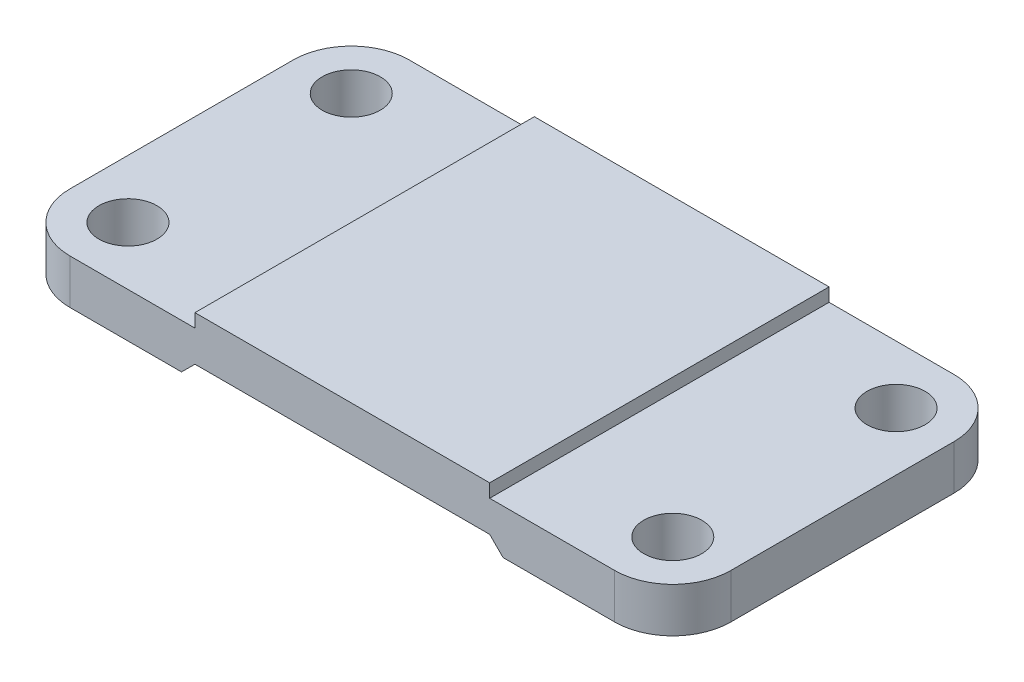
ISO-10303-21;
HEADER;
FILE_DESCRIPTION(('STEP AP214'),'2;1');
FILE_NAME('part.step','',(''),(''),'','','');
FILE_SCHEMA(('AUTOMOTIVE_DESIGN { 1 0 10303 214 1 1 1 1 }'));
ENDSEC;
DATA;
#1=APPLICATION_CONTEXT('core data for automotive mechanical design processes');
#2=APPLICATION_PROTOCOL_DEFINITION('international standard','automotive_design',2000,#1);
#3=PRODUCT_CONTEXT('',#1,'mechanical');
#4=PRODUCT('Part','Part','',(#3));
#5=PRODUCT_RELATED_PRODUCT_CATEGORY('part','',(#4));
#6=PRODUCT_DEFINITION_FORMATION('','',#4);
#7=PRODUCT_DEFINITION_CONTEXT('part definition',#1,'design');
#8=PRODUCT_DEFINITION('design','',#6,#7);
#9=PRODUCT_DEFINITION_SHAPE('','',#8);
#10=(LENGTH_UNIT() NAMED_UNIT(*) SI_UNIT(.MILLI.,.METRE.));
#11=(NAMED_UNIT(*) PLANE_ANGLE_UNIT() SI_UNIT($,.RADIAN.));
#12=(NAMED_UNIT(*) SI_UNIT($,.STERADIAN.) SOLID_ANGLE_UNIT());
#13=UNCERTAINTY_MEASURE_WITH_UNIT(LENGTH_MEASURE(1.E-05),#10,'distance_accuracy_value','');
#14=(GEOMETRIC_REPRESENTATION_CONTEXT(3) GLOBAL_UNCERTAINTY_ASSIGNED_CONTEXT((#13)) GLOBAL_UNIT_ASSIGNED_CONTEXT((#10,
#11,#12)) REPRESENTATION_CONTEXT('',''));
#15=CARTESIAN_POINT('',(0.,0.,0.));
#16=DIRECTION('',(0.,0.,1.));
#17=DIRECTION('',(1.,0.,0.));
#18=AXIS2_PLACEMENT_3D('',#15,#16,#17);
#19=CARTESIAN_POINT('',(-61.,0.,25.));
#20=DIRECTION('',(0.,1.,0.));
#21=DIRECTION('',(0.,0.,1.));
#22=AXIS2_PLACEMENT_3D('',#19,#20,#21);
#23=PLANE('',#22);
#24=CARTESIAN_POINT('',(61.,0.,-25.));
#25=DIRECTION('',(0.,1.,0.));
#26=DIRECTION('',(0.,0.,-1.));
#27=AXIS2_PLACEMENT_3D('',#24,#25,#26);
#28=CIRCLE('',#27,6.5);
#29=CARTESIAN_POINT('',(61.,0.,-31.5));
#30=VERTEX_POINT('',#29);
#31=EDGE_CURVE('E262',#30,#30,#28,.T.);
#32=ORIENTED_EDGE('',*,*,#31,.F.);
#33=EDGE_LOOP('',(#32));
#34=FACE_BOUND('',#33,.T.);
#35=CARTESIAN_POINT('',(61.,0.,25.));
#36=DIRECTION('',(0.,1.,0.));
#37=DIRECTION('',(0.,0.,1.));
#38=AXIS2_PLACEMENT_3D('',#35,#36,#37);
#39=CIRCLE('',#38,6.5);
#40=CARTESIAN_POINT('',(61.,0.,31.5));
#41=VERTEX_POINT('',#40);
#42=EDGE_CURVE('E268',#41,#41,#39,.T.);
#43=ORIENTED_EDGE('',*,*,#42,.F.);
#44=EDGE_LOOP('',(#43));
#45=FACE_BOUND('',#44,.T.);
#46=DIRECTION('',(-1.,0.,0.));
#47=VECTOR('',#46,1.);
#48=CARTESIAN_POINT('',(-60.9999999999999,0.,-38.));
#49=LINE('',#48,#47);
#50=CARTESIAN_POINT('',(60.9999999999999,0.,-38.));
#51=VERTEX_POINT('',#50);
#52=CARTESIAN_POINT('',(33.,0.,-38.));
#53=VERTEX_POINT('',#52);
#54=EDGE_CURVE('E165',#51,#53,#49,.T.);
#55=ORIENTED_EDGE('',*,*,#54,.T.);
#56=DIRECTION('',(0.,0.,1.));
#57=VECTOR('',#56,1.);
#58=CARTESIAN_POINT('',(33.,0.,-38.));
#59=LINE('',#58,#57);
#60=CARTESIAN_POINT('',(33.,0.,38.));
#61=VERTEX_POINT('',#60);
#62=EDGE_CURVE('E150',#53,#61,#59,.T.);
#63=ORIENTED_EDGE('',*,*,#62,.T.);
#64=DIRECTION('',(1.,0.,0.));
#65=VECTOR('',#64,1.);
#66=CARTESIAN_POINT('',(-60.9999999999999,0.,38.));
#67=LINE('',#66,#65);
#68=CARTESIAN_POINT('',(60.9999999999999,0.,38.));
#69=VERTEX_POINT('',#68);
#70=EDGE_CURVE('E219',#61,#69,#67,.T.);
#71=ORIENTED_EDGE('',*,*,#70,.T.);
#72=CARTESIAN_POINT('',(61.,0.,25.));
#73=DIRECTION('',(0.,1.,0.));
#74=DIRECTION('',(0.,0.,1.));
#75=AXIS2_PLACEMENT_3D('',#72,#73,#74);
#76=CIRCLE('',#75,13.);
#77=CARTESIAN_POINT('',(74.,0.,24.9999999999999));
#78=VERTEX_POINT('',#77);
#79=EDGE_CURVE('E224',#69,#78,#76,.T.);
#80=ORIENTED_EDGE('',*,*,#79,.T.);
#81=DIRECTION('',(0.,0.,-1.));
#82=VECTOR('',#81,1.);
#83=CARTESIAN_POINT('',(74.,0.,-24.9999999999999));
#84=LINE('',#83,#82);
#85=CARTESIAN_POINT('',(74.,0.,-24.9999999999999));
#86=VERTEX_POINT('',#85);
#87=EDGE_CURVE('E226',#78,#86,#84,.T.);
#88=ORIENTED_EDGE('',*,*,#87,.T.);
#89=CARTESIAN_POINT('',(61.,0.,-25.));
#90=DIRECTION('',(0.,1.,0.));
#91=DIRECTION('',(0.,0.,-1.));
#92=AXIS2_PLACEMENT_3D('',#89,#90,#91);
#93=CIRCLE('',#92,13.);
#94=EDGE_CURVE('E174',#86,#51,#93,.T.);
#95=ORIENTED_EDGE('',*,*,#94,.T.);
#96=EDGE_LOOP('',(#55,#63,#71,#80,#88,#95));
#97=FACE_BOUND('',#96,.T.);
#98=ADVANCED_FACE('F38',(#34,#45,#97),#23,.T.);
#99=CARTESIAN_POINT('',(-61.,-10.,25.));
#100=DIRECTION('',(0.,1.,0.));
#101=DIRECTION('',(0.,0.,1.));
#102=AXIS2_PLACEMENT_3D('',#99,#100,#101);
#103=PLANE('',#102);
#104=CARTESIAN_POINT('',(-61.,-10.,-25.));
#105=DIRECTION('',(0.,1.,0.));
#106=DIRECTION('',(0.,0.,1.));
#107=AXIS2_PLACEMENT_3D('',#104,#105,#106);
#108=CIRCLE('',#107,6.5);
#109=CARTESIAN_POINT('',(-61.,-10.,-18.5));
#110=VERTEX_POINT('',#109);
#111=EDGE_CURVE('E220',#110,#110,#108,.T.);
#112=ORIENTED_EDGE('',*,*,#111,.T.);
#113=EDGE_LOOP('',(#112));
#114=FACE_BOUND('',#113,.T.);
#115=CARTESIAN_POINT('',(-61.,-10.,25.));
#116=DIRECTION('',(0.,1.,0.));
#117=DIRECTION('',(0.,0.,-1.));
#118=AXIS2_PLACEMENT_3D('',#115,#116,#117);
#119=CIRCLE('',#118,6.5);
#120=CARTESIAN_POINT('',(-61.,-10.,18.5));
#121=VERTEX_POINT('',#120);
#122=EDGE_CURVE('E271',#121,#121,#119,.T.);
#123=ORIENTED_EDGE('',*,*,#122,.T.);
#124=EDGE_LOOP('',(#123));
#125=FACE_BOUND('',#124,.T.);
#126=DIRECTION('',(-1.,0.,0.));
#127=VECTOR('',#126,1.);
#128=CARTESIAN_POINT('',(-60.9999999999999,-10.,-38.));
#129=LINE('',#128,#127);
#130=CARTESIAN_POINT('',(-36.,-10.,-38.));
#131=VERTEX_POINT('',#130);
#132=CARTESIAN_POINT('',(-60.9999999999999,-10.,-38.));
#133=VERTEX_POINT('',#132);
#134=EDGE_CURVE('E244',#131,#133,#129,.T.);
#135=ORIENTED_EDGE('',*,*,#134,.F.);
#136=DIRECTION('',(0.,0.,1.));
#137=VECTOR('',#136,1.);
#138=CARTESIAN_POINT('',(-36.,-10.,-38.));
#139=LINE('',#138,#137);
#140=CARTESIAN_POINT('',(-36.,-10.,38.));
#141=VERTEX_POINT('',#140);
#142=EDGE_CURVE('E280',#131,#141,#139,.T.);
#143=ORIENTED_EDGE('',*,*,#142,.T.);
#144=DIRECTION('',(1.,0.,0.));
#145=VECTOR('',#144,1.);
#146=CARTESIAN_POINT('',(-60.9999999999999,-10.,38.));
#147=LINE('',#146,#145);
#148=CARTESIAN_POINT('',(-60.9999999999999,-10.,38.));
#149=VERTEX_POINT('',#148);
#150=EDGE_CURVE('E251',#149,#141,#147,.T.);
#151=ORIENTED_EDGE('',*,*,#150,.F.);
#152=CARTESIAN_POINT('',(-61.,-10.,25.));
#153=DIRECTION('',(0.,1.,0.));
#154=DIRECTION('',(0.,0.,1.));
#155=AXIS2_PLACEMENT_3D('',#152,#153,#154);
#156=CIRCLE('',#155,13.);
#157=CARTESIAN_POINT('',(-74.,-10.,24.9999999999999));
#158=VERTEX_POINT('',#157);
#159=EDGE_CURVE('E185',#158,#149,#156,.T.);
#160=ORIENTED_EDGE('',*,*,#159,.F.);
#161=DIRECTION('',(0.,0.,1.));
#162=VECTOR('',#161,1.);
#163=CARTESIAN_POINT('',(-74.,-10.,-24.9999999999999));
#164=LINE('',#163,#162);
#165=CARTESIAN_POINT('',(-74.,-10.,-24.9999999999999));
#166=VERTEX_POINT('',#165);
#167=EDGE_CURVE('E201',#166,#158,#164,.T.);
#168=ORIENTED_EDGE('',*,*,#167,.F.);
#169=CARTESIAN_POINT('',(-61.,-10.,-25.));
#170=DIRECTION('',(0.,1.,0.));
#171=DIRECTION('',(0.,0.,1.));
#172=AXIS2_PLACEMENT_3D('',#169,#170,#171);
#173=CIRCLE('',#172,13.);
#174=EDGE_CURVE('E207',#133,#166,#173,.T.);
#175=ORIENTED_EDGE('',*,*,#174,.F.);
#176=EDGE_LOOP('',(#135,#143,#151,#160,#168,#175));
#177=FACE_BOUND('',#176,.T.);
#178=ADVANCED_FACE('F330',(#114,#125,#177),#103,.F.);
#179=CARTESIAN_POINT('',(-61.,-10.,25.));
#180=DIRECTION('',(0.,1.,0.));
#181=DIRECTION('',(0.,0.,1.));
#182=AXIS2_PLACEMENT_3D('',#179,#180,#181);
#183=CYLINDRICAL_SURFACE('',#182,13.);
#184=CARTESIAN_POINT('',(-61.,0.,25.));
#185=DIRECTION('',(0.,1.,0.));
#186=DIRECTION('',(0.,0.,1.));
#187=AXIS2_PLACEMENT_3D('',#184,#185,#186);
#188=CIRCLE('',#187,13.);
#189=CARTESIAN_POINT('',(-74.,0.,24.9999999999999));
#190=VERTEX_POINT('',#189);
#191=CARTESIAN_POINT('',(-60.9999999999999,0.,38.));
#192=VERTEX_POINT('',#191);
#193=EDGE_CURVE('E216',#190,#192,#188,.T.);
#194=ORIENTED_EDGE('',*,*,#193,.F.);
#195=DIRECTION('',(0.,1.,0.));
#196=VECTOR('',#195,1.);
#197=CARTESIAN_POINT('',(-74.,-10.,24.9999999999999));
#198=LINE('',#197,#196);
#199=EDGE_CURVE('E11',#158,#190,#198,.T.);
#200=ORIENTED_EDGE('',*,*,#199,.F.);
#201=ORIENTED_EDGE('',*,*,#159,.T.);
#202=DIRECTION('',(0.,1.,0.));
#203=VECTOR('',#202,1.);
#204=CARTESIAN_POINT('',(-60.9999999999999,-10.,38.));
#205=LINE('',#204,#203);
#206=EDGE_CURVE('E42',#149,#192,#205,.T.);
#207=ORIENTED_EDGE('',*,*,#206,.T.);
#208=EDGE_LOOP('',(#194,#200,#201,#207));
#209=FACE_BOUND('',#208,.T.);
#210=ADVANCED_FACE('F40',(#209),#183,.T.);
#211=CARTESIAN_POINT('',(-74.,-10.,-24.9999999999999));
#212=DIRECTION('',(-1.,0.,0.));
#213=DIRECTION('',(0.,0.,1.));
#214=AXIS2_PLACEMENT_3D('',#211,#212,#213);
#215=PLANE('',#214);
#216=DIRECTION('',(0.,0.,1.));
#217=VECTOR('',#216,1.);
#218=CARTESIAN_POINT('',(-74.,0.,-24.9999999999999));
#219=LINE('',#218,#217);
#220=CARTESIAN_POINT('',(-74.,0.,-24.9999999999999));
#221=VERTEX_POINT('',#220);
#222=EDGE_CURVE('E179',#221,#190,#219,.T.);
#223=ORIENTED_EDGE('',*,*,#222,.F.);
#224=DIRECTION('',(0.,1.,0.));
#225=VECTOR('',#224,1.);
#226=CARTESIAN_POINT('',(-74.,-10.,-24.9999999999999));
#227=LINE('',#226,#225);
#228=EDGE_CURVE('E47',#166,#221,#227,.T.);
#229=ORIENTED_EDGE('',*,*,#228,.F.);
#230=ORIENTED_EDGE('',*,*,#167,.T.);
#231=ORIENTED_EDGE('',*,*,#199,.T.);
#232=EDGE_LOOP('',(#223,#229,#230,#231));
#233=FACE_BOUND('',#232,.T.);
#234=ADVANCED_FACE('F332',(#233),#215,.T.);
#235=CARTESIAN_POINT('',(-61.,-10.,-25.));
#236=DIRECTION('',(0.,1.,0.));
#237=DIRECTION('',(0.,0.,1.));
#238=AXIS2_PLACEMENT_3D('',#235,#236,#237);
#239=CYLINDRICAL_SURFACE('',#238,13.);
#240=CARTESIAN_POINT('',(-61.,0.,-25.));
#241=DIRECTION('',(0.,1.,0.));
#242=DIRECTION('',(0.,0.,1.));
#243=AXIS2_PLACEMENT_3D('',#240,#241,#242);
#244=CIRCLE('',#243,13.);
#245=CARTESIAN_POINT('',(-60.9999999999999,0.,-38.));
#246=VERTEX_POINT('',#245);
#247=EDGE_CURVE('E175',#246,#221,#244,.T.);
#248=ORIENTED_EDGE('',*,*,#247,.F.);
#249=DIRECTION('',(0.,1.,0.));
#250=VECTOR('',#249,1.);
#251=CARTESIAN_POINT('',(-60.9999999999999,-10.,-38.));
#252=LINE('',#251,#250);
#253=EDGE_CURVE('E188',#133,#246,#252,.T.);
#254=ORIENTED_EDGE('',*,*,#253,.F.);
#255=ORIENTED_EDGE('',*,*,#174,.T.);
#256=ORIENTED_EDGE('',*,*,#228,.T.);
#257=EDGE_LOOP('',(#248,#254,#255,#256));
#258=FACE_BOUND('',#257,.T.);
#259=ADVANCED_FACE('F336',(#258),#239,.T.);
#260=CARTESIAN_POINT('',(-60.9999999999999,-10.,-38.));
#261=DIRECTION('',(0.,0.,-1.));
#262=DIRECTION('',(-1.,0.,0.));
#263=AXIS2_PLACEMENT_3D('',#260,#261,#262);
#264=PLANE('',#263);
#265=DIRECTION('',(-0.707106781186551,-0.707106781186544,0.));
#266=VECTOR('',#265,1.);
#267=CARTESIAN_POINT('',(-33.,-7.00000000000001,-38.));
#268=LINE('',#267,#266);
#269=CARTESIAN_POINT('',(-33.,-7.00000000000001,-38.));
#270=VERTEX_POINT('',#269);
#271=EDGE_CURVE('E291',#270,#131,#268,.T.);
#272=ORIENTED_EDGE('',*,*,#271,.T.);
#273=ORIENTED_EDGE('',*,*,#134,.T.);
#274=ORIENTED_EDGE('',*,*,#253,.T.);
#275=CARTESIAN_POINT('',(-33.,0.,-38.));
#276=VERTEX_POINT('',#275);
#277=EDGE_CURVE('E176',#276,#246,#49,.T.);
#278=ORIENTED_EDGE('',*,*,#277,.F.);
#279=DIRECTION('',(0.,-1.,0.));
#280=VECTOR('',#279,1.);
#281=CARTESIAN_POINT('',(-33.,0.,-38.));
#282=LINE('',#281,#280);
#283=CARTESIAN_POINT('',(-33.,3.,-38.));
#284=VERTEX_POINT('',#283);
#285=EDGE_CURVE('E158',#284,#276,#282,.T.);
#286=ORIENTED_EDGE('',*,*,#285,.F.);
#287=DIRECTION('',(-1.,0.,0.));
#288=VECTOR('',#287,1.);
#289=CARTESIAN_POINT('',(-33.,3.,-38.));
#290=LINE('',#289,#288);
#291=CARTESIAN_POINT('',(33.,3.,-38.));
#292=VERTEX_POINT('',#291);
#293=EDGE_CURVE('E169',#292,#284,#290,.T.);
#294=ORIENTED_EDGE('',*,*,#293,.F.);
#295=DIRECTION('',(0.,1.,0.));
#296=VECTOR('',#295,1.);
#297=CARTESIAN_POINT('',(33.,3.,-38.));
#298=LINE('',#297,#296);
#299=EDGE_CURVE('E153',#53,#292,#298,.T.);
#300=ORIENTED_EDGE('',*,*,#299,.F.);
#301=ORIENTED_EDGE('',*,*,#54,.F.);
#302=DIRECTION('',(0.,1.,0.));
#303=VECTOR('',#302,1.);
#304=CARTESIAN_POINT('',(60.9999999999999,-10.,-38.));
#305=LINE('',#304,#303);
#306=CARTESIAN_POINT('',(60.9999999999999,-10.,-38.));
#307=VERTEX_POINT('',#306);
#308=EDGE_CURVE('E191',#307,#51,#305,.T.);
#309=ORIENTED_EDGE('',*,*,#308,.F.);
#310=CARTESIAN_POINT('',(36.,-10.,-38.));
#311=VERTEX_POINT('',#310);
#312=EDGE_CURVE('E212',#307,#311,#129,.T.);
#313=ORIENTED_EDGE('',*,*,#312,.T.);
#314=DIRECTION('',(-0.707106781186552,0.707106781186543,0.));
#315=VECTOR('',#314,1.);
#316=CARTESIAN_POINT('',(36.,-10.,-38.));
#317=LINE('',#316,#315);
#318=CARTESIAN_POINT('',(33.,-7.00000000000001,-38.));
#319=VERTEX_POINT('',#318);
#320=EDGE_CURVE('E63',#311,#319,#317,.T.);
#321=ORIENTED_EDGE('',*,*,#320,.T.);
#322=DIRECTION('',(-1.,0.,0.));
#323=VECTOR('',#322,1.);
#324=CARTESIAN_POINT('',(33.,-7.00000000000001,-38.));
#325=LINE('',#324,#323);
#326=EDGE_CURVE('E283',#319,#270,#325,.T.);
#327=ORIENTED_EDGE('',*,*,#326,.T.);
#328=EDGE_LOOP('',(#272,#273,#274,#278,#286,#294,#300,#301,#309,#313,#321,#327));
#329=FACE_BOUND('',#328,.T.);
#330=ADVANCED_FACE('F164',(#329),#264,.T.);
#331=CARTESIAN_POINT('',(61.,-10.,-25.));
#332=DIRECTION('',(0.,1.,0.));
#333=DIRECTION('',(0.,0.,1.));
#334=AXIS2_PLACEMENT_3D('',#331,#332,#333);
#335=CYLINDRICAL_SURFACE('',#334,13.);
#336=ORIENTED_EDGE('',*,*,#94,.F.);
#337=DIRECTION('',(0.,1.,0.));
#338=VECTOR('',#337,1.);
#339=CARTESIAN_POINT('',(74.,-10.,-24.9999999999999));
#340=LINE('',#339,#338);
#341=CARTESIAN_POINT('',(74.,-10.,-24.9999999999999));
#342=VERTEX_POINT('',#341);
#343=EDGE_CURVE('E193',#342,#86,#340,.T.);
#344=ORIENTED_EDGE('',*,*,#343,.F.);
#345=CARTESIAN_POINT('',(61.,-10.,-25.));
#346=DIRECTION('',(0.,1.,0.));
#347=DIRECTION('',(0.,0.,-1.));
#348=AXIS2_PLACEMENT_3D('',#345,#346,#347);
#349=CIRCLE('',#348,13.);
#350=EDGE_CURVE('E237',#342,#307,#349,.T.);
#351=ORIENTED_EDGE('',*,*,#350,.T.);
#352=ORIENTED_EDGE('',*,*,#308,.T.);
#353=EDGE_LOOP('',(#336,#344,#351,#352));
#354=FACE_BOUND('',#353,.T.);
#355=ADVANCED_FACE('F236',(#354),#335,.T.);
#356=CARTESIAN_POINT('',(74.,-10.,-24.9999999999999));
#357=DIRECTION('',(1.,0.,0.));
#358=DIRECTION('',(0.,0.,-1.));
#359=AXIS2_PLACEMENT_3D('',#356,#357,#358);
#360=PLANE('',#359);
#361=ORIENTED_EDGE('',*,*,#87,.F.);
#362=DIRECTION('',(0.,1.,0.));
#363=VECTOR('',#362,1.);
#364=CARTESIAN_POINT('',(74.,-10.,24.9999999999999));
#365=LINE('',#364,#363);
#366=CARTESIAN_POINT('',(74.,-10.,24.9999999999999));
#367=VERTEX_POINT('',#366);
#368=EDGE_CURVE('E195',#367,#78,#365,.T.);
#369=ORIENTED_EDGE('',*,*,#368,.F.);
#370=DIRECTION('',(0.,0.,-1.));
#371=VECTOR('',#370,1.);
#372=CARTESIAN_POINT('',(74.,-10.,-24.9999999999999));
#373=LINE('',#372,#371);
#374=EDGE_CURVE('E232',#367,#342,#373,.T.);
#375=ORIENTED_EDGE('',*,*,#374,.T.);
#376=ORIENTED_EDGE('',*,*,#343,.T.);
#377=EDGE_LOOP('',(#361,#369,#375,#376));
#378=FACE_BOUND('',#377,.T.);
#379=ADVANCED_FACE('F229',(#378),#360,.T.);
#380=CARTESIAN_POINT('',(61.,-10.,25.));
#381=DIRECTION('',(0.,1.,0.));
#382=DIRECTION('',(0.,0.,1.));
#383=AXIS2_PLACEMENT_3D('',#380,#381,#382);
#384=CYLINDRICAL_SURFACE('',#383,13.);
#385=ORIENTED_EDGE('',*,*,#79,.F.);
#386=DIRECTION('',(0.,1.,0.));
#387=VECTOR('',#386,1.);
#388=CARTESIAN_POINT('',(60.9999999999999,-10.,38.));
#389=LINE('',#388,#387);
#390=CARTESIAN_POINT('',(60.9999999999999,-10.,38.));
#391=VERTEX_POINT('',#390);
#392=EDGE_CURVE('E196',#391,#69,#389,.T.);
#393=ORIENTED_EDGE('',*,*,#392,.F.);
#394=CARTESIAN_POINT('',(61.,-10.,25.));
#395=DIRECTION('',(0.,1.,0.));
#396=DIRECTION('',(0.,0.,1.));
#397=AXIS2_PLACEMENT_3D('',#394,#395,#396);
#398=CIRCLE('',#397,13.);
#399=EDGE_CURVE('E248',#391,#367,#398,.T.);
#400=ORIENTED_EDGE('',*,*,#399,.T.);
#401=ORIENTED_EDGE('',*,*,#368,.T.);
#402=EDGE_LOOP('',(#385,#393,#400,#401));
#403=FACE_BOUND('',#402,.T.);
#404=ADVANCED_FACE('F382',(#403),#384,.T.);
#405=CARTESIAN_POINT('',(-60.9999999999999,-10.,38.));
#406=DIRECTION('',(0.,0.,1.));
#407=DIRECTION('',(1.,0.,0.));
#408=AXIS2_PLACEMENT_3D('',#405,#406,#407);
#409=PLANE('',#408);
#410=DIRECTION('',(-0.707106781186551,-0.707106781186544,0.));
#411=VECTOR('',#410,1.);
#412=CARTESIAN_POINT('',(-33.,-7.00000000000001,38.));
#413=LINE('',#412,#411);
#414=CARTESIAN_POINT('',(-33.,-7.00000000000001,38.));
#415=VERTEX_POINT('',#414);
#416=EDGE_CURVE('E295',#415,#141,#413,.T.);
#417=ORIENTED_EDGE('',*,*,#416,.F.);
#418=DIRECTION('',(-1.,0.,0.));
#419=VECTOR('',#418,1.);
#420=CARTESIAN_POINT('',(33.,-7.00000000000001,38.));
#421=LINE('',#420,#419);
#422=CARTESIAN_POINT('',(33.,-7.00000000000001,38.));
#423=VERTEX_POINT('',#422);
#424=EDGE_CURVE('E288',#423,#415,#421,.T.);
#425=ORIENTED_EDGE('',*,*,#424,.F.);
#426=DIRECTION('',(-0.707106781186552,0.707106781186543,0.));
#427=VECTOR('',#426,1.);
#428=CARTESIAN_POINT('',(36.,-10.,38.));
#429=LINE('',#428,#427);
#430=CARTESIAN_POINT('',(36.,-10.,38.));
#431=VERTEX_POINT('',#430);
#432=EDGE_CURVE('E292',#431,#423,#429,.T.);
#433=ORIENTED_EDGE('',*,*,#432,.F.);
#434=EDGE_CURVE('E254',#431,#391,#147,.T.);
#435=ORIENTED_EDGE('',*,*,#434,.T.);
#436=ORIENTED_EDGE('',*,*,#392,.T.);
#437=ORIENTED_EDGE('',*,*,#70,.F.);
#438=DIRECTION('',(0.,1.,0.));
#439=VECTOR('',#438,1.);
#440=CARTESIAN_POINT('',(33.,3.,38.));
#441=LINE('',#440,#439);
#442=CARTESIAN_POINT('',(33.,3.,38.));
#443=VERTEX_POINT('',#442);
#444=EDGE_CURVE('E55',#61,#443,#441,.T.);
#445=ORIENTED_EDGE('',*,*,#444,.T.);
#446=DIRECTION('',(-1.,0.,0.));
#447=VECTOR('',#446,1.);
#448=CARTESIAN_POINT('',(-33.,3.,38.));
#449=LINE('',#448,#447);
#450=CARTESIAN_POINT('',(-33.,3.,38.));
#451=VERTEX_POINT('',#450);
#452=EDGE_CURVE('E308',#443,#451,#449,.T.);
#453=ORIENTED_EDGE('',*,*,#452,.T.);
#454=DIRECTION('',(0.,-1.,0.));
#455=VECTOR('',#454,1.);
#456=CARTESIAN_POINT('',(-33.,0.,38.));
#457=LINE('',#456,#455);
#458=CARTESIAN_POINT('',(-33.,0.,38.));
#459=VERTEX_POINT('',#458);
#460=EDGE_CURVE('E170',#451,#459,#457,.T.);
#461=ORIENTED_EDGE('',*,*,#460,.T.);
#462=EDGE_CURVE('E221',#192,#459,#67,.T.);
#463=ORIENTED_EDGE('',*,*,#462,.F.);
#464=ORIENTED_EDGE('',*,*,#206,.F.);
#465=ORIENTED_EDGE('',*,*,#150,.T.);
#466=EDGE_LOOP('',(#417,#425,#433,#435,#436,#437,#445,#453,#461,#463,#464,#465));
#467=FACE_BOUND('',#466,.T.);
#468=ADVANCED_FACE('F325',(#467),#409,.T.);
#469=CARTESIAN_POINT('',(61.,-10.,25.));
#470=DIRECTION('',(0.,1.,0.));
#471=DIRECTION('',(0.,0.,1.));
#472=AXIS2_PLACEMENT_3D('',#469,#470,#471);
#473=CIRCLE('',#472,6.5);
#474=CARTESIAN_POINT('',(61.,-10.,31.5));
#475=VERTEX_POINT('',#474);
#476=EDGE_CURVE('E265',#475,#475,#473,.T.);
#477=ORIENTED_EDGE('',*,*,#476,.T.);
#478=EDGE_LOOP('',(#477));
#479=FACE_BOUND('',#478,.T.);
#480=CARTESIAN_POINT('',(61.,-10.,-25.));
#481=DIRECTION('',(0.,1.,0.));
#482=DIRECTION('',(0.,0.,-1.));
#483=AXIS2_PLACEMENT_3D('',#480,#481,#482);
#484=CIRCLE('',#483,6.5);
#485=CARTESIAN_POINT('',(61.,-10.,-31.5));
#486=VERTEX_POINT('',#485);
#487=EDGE_CURVE('E259',#486,#486,#484,.T.);
#488=ORIENTED_EDGE('',*,*,#487,.T.);
#489=EDGE_LOOP('',(#488));
#490=FACE_BOUND('',#489,.T.);
#491=ORIENTED_EDGE('',*,*,#434,.F.);
#492=DIRECTION('',(0.,0.,1.));
#493=VECTOR('',#492,1.);
#494=CARTESIAN_POINT('',(36.,-10.,-38.));
#495=LINE('',#494,#493);
#496=EDGE_CURVE('E243',#311,#431,#495,.T.);
#497=ORIENTED_EDGE('',*,*,#496,.F.);
#498=ORIENTED_EDGE('',*,*,#312,.F.);
#499=ORIENTED_EDGE('',*,*,#350,.F.);
#500=ORIENTED_EDGE('',*,*,#374,.F.);
#501=ORIENTED_EDGE('',*,*,#399,.F.);
#502=EDGE_LOOP('',(#491,#497,#498,#499,#500,#501));
#503=FACE_BOUND('',#502,.T.);
#504=ADVANCED_FACE('F242',(#479,#490,#503),#103,.F.);
#505=DIRECTION('',(0.,0.,1.));
#506=VECTOR('',#505,1.);
#507=CARTESIAN_POINT('',(-33.,0.,-38.));
#508=LINE('',#507,#506);
#509=EDGE_CURVE('E297',#276,#459,#508,.T.);
#510=ORIENTED_EDGE('',*,*,#509,.F.);
#511=ORIENTED_EDGE('',*,*,#277,.T.);
#512=ORIENTED_EDGE('',*,*,#247,.T.);
#513=ORIENTED_EDGE('',*,*,#222,.T.);
#514=ORIENTED_EDGE('',*,*,#193,.T.);
#515=ORIENTED_EDGE('',*,*,#462,.T.);
#516=EDGE_LOOP('',(#510,#511,#512,#513,#514,#515));
#517=FACE_BOUND('',#516,.T.);
#518=CARTESIAN_POINT('',(-61.,0.,25.));
#519=DIRECTION('',(0.,1.,0.));
#520=DIRECTION('',(0.,0.,-1.));
#521=AXIS2_PLACEMENT_3D('',#518,#519,#520);
#522=CIRCLE('',#521,6.5);
#523=CARTESIAN_POINT('',(-61.,0.,18.5));
#524=VERTEX_POINT('',#523);
#525=EDGE_CURVE('E274',#524,#524,#522,.T.);
#526=ORIENTED_EDGE('',*,*,#525,.F.);
#527=EDGE_LOOP('',(#526));
#528=FACE_BOUND('',#527,.T.);
#529=CARTESIAN_POINT('',(-61.,0.,-25.));
#530=DIRECTION('',(0.,1.,0.));
#531=DIRECTION('',(0.,0.,1.));
#532=AXIS2_PLACEMENT_3D('',#529,#530,#531);
#533=CIRCLE('',#532,6.5);
#534=CARTESIAN_POINT('',(-61.,0.,-18.5));
#535=VERTEX_POINT('',#534);
#536=EDGE_CURVE('E256',#535,#535,#533,.T.);
#537=ORIENTED_EDGE('',*,*,#536,.F.);
#538=EDGE_LOOP('',(#537));
#539=FACE_BOUND('',#538,.T.);
#540=ADVANCED_FACE('F322',(#517,#528,#539),#23,.T.);
#541=CARTESIAN_POINT('',(-61.,-10.,-25.));
#542=DIRECTION('',(0.,1.,0.));
#543=DIRECTION('',(0.,0.,1.));
#544=AXIS2_PLACEMENT_3D('',#541,#542,#543);
#545=CYLINDRICAL_SURFACE('',#544,6.5);
#546=ORIENTED_EDGE('',*,*,#111,.F.);
#547=EDGE_LOOP('',(#546));
#548=FACE_BOUND('',#547,.T.);
#549=ORIENTED_EDGE('',*,*,#536,.T.);
#550=EDGE_LOOP('',(#549));
#551=FACE_BOUND('',#550,.T.);
#552=ADVANCED_FACE('F369',(#548,#551),#545,.F.);
#553=CARTESIAN_POINT('',(61.,-10.,-25.));
#554=DIRECTION('',(0.,1.,0.));
#555=DIRECTION('',(0.,0.,1.));
#556=AXIS2_PLACEMENT_3D('',#553,#554,#555);
#557=CYLINDRICAL_SURFACE('',#556,6.5);
#558=ORIENTED_EDGE('',*,*,#487,.F.);
#559=EDGE_LOOP('',(#558));
#560=FACE_BOUND('',#559,.T.);
#561=ORIENTED_EDGE('',*,*,#31,.T.);
#562=EDGE_LOOP('',(#561));
#563=FACE_BOUND('',#562,.T.);
#564=ADVANCED_FACE('F374',(#560,#563),#557,.F.);
#565=CARTESIAN_POINT('',(61.,-10.,25.));
#566=DIRECTION('',(0.,1.,0.));
#567=DIRECTION('',(0.,0.,1.));
#568=AXIS2_PLACEMENT_3D('',#565,#566,#567);
#569=CYLINDRICAL_SURFACE('',#568,6.5);
#570=ORIENTED_EDGE('',*,*,#476,.F.);
#571=EDGE_LOOP('',(#570));
#572=FACE_BOUND('',#571,.T.);
#573=ORIENTED_EDGE('',*,*,#42,.T.);
#574=EDGE_LOOP('',(#573));
#575=FACE_BOUND('',#574,.T.);
#576=ADVANCED_FACE('F387',(#572,#575),#569,.F.);
#577=CARTESIAN_POINT('',(-61.,-10.,25.));
#578=DIRECTION('',(0.,1.,0.));
#579=DIRECTION('',(0.,0.,1.));
#580=AXIS2_PLACEMENT_3D('',#577,#578,#579);
#581=CYLINDRICAL_SURFACE('',#580,6.5);
#582=ORIENTED_EDGE('',*,*,#122,.F.);
#583=EDGE_LOOP('',(#582));
#584=FACE_BOUND('',#583,.T.);
#585=ORIENTED_EDGE('',*,*,#525,.T.);
#586=EDGE_LOOP('',(#585));
#587=FACE_BOUND('',#586,.T.);
#588=ADVANCED_FACE('F391',(#584,#587),#581,.F.);
#589=CARTESIAN_POINT('',(-33.,-7.00000000000001,-38.));
#590=DIRECTION('',(-0.707106781186544,0.707106781186551,0.));
#591=DIRECTION('',(-0.707106781186551,-0.707106781186544,0.));
#592=AXIS2_PLACEMENT_3D('',#589,#590,#591);
#593=PLANE('',#592);
#594=ORIENTED_EDGE('',*,*,#416,.T.);
#595=ORIENTED_EDGE('',*,*,#142,.F.);
#596=ORIENTED_EDGE('',*,*,#271,.F.);
#597=DIRECTION('',(0.,0.,1.));
#598=VECTOR('',#597,1.);
#599=CARTESIAN_POINT('',(-33.,-7.00000000000001,-38.));
#600=LINE('',#599,#598);
#601=EDGE_CURVE('E277',#270,#415,#600,.T.);
#602=ORIENTED_EDGE('',*,*,#601,.T.);
#603=EDGE_LOOP('',(#594,#595,#596,#602));
#604=FACE_BOUND('',#603,.T.);
#605=ADVANCED_FACE('F341',(#604),#593,.F.);
#606=CARTESIAN_POINT('',(33.,-7.00000000000001,-38.));
#607=DIRECTION('',(0.,1.,0.));
#608=DIRECTION('',(0.,0.,1.));
#609=AXIS2_PLACEMENT_3D('',#606,#607,#608);
#610=PLANE('',#609);
#611=ORIENTED_EDGE('',*,*,#424,.T.);
#612=ORIENTED_EDGE('',*,*,#601,.F.);
#613=ORIENTED_EDGE('',*,*,#326,.F.);
#614=DIRECTION('',(0.,0.,1.));
#615=VECTOR('',#614,1.);
#616=CARTESIAN_POINT('',(33.,-7.00000000000001,-38.));
#617=LINE('',#616,#615);
#618=EDGE_CURVE('E285',#319,#423,#617,.T.);
#619=ORIENTED_EDGE('',*,*,#618,.T.);
#620=EDGE_LOOP('',(#611,#612,#613,#619));
#621=FACE_BOUND('',#620,.T.);
#622=ADVANCED_FACE('F345',(#621),#610,.F.);
#623=CARTESIAN_POINT('',(36.,-10.,-38.));
#624=DIRECTION('',(0.707106781186543,0.707106781186552,0.));
#625=DIRECTION('',(-0.707106781186552,0.707106781186543,0.));
#626=AXIS2_PLACEMENT_3D('',#623,#624,#625);
#627=PLANE('',#626);
#628=ORIENTED_EDGE('',*,*,#432,.T.);
#629=ORIENTED_EDGE('',*,*,#618,.F.);
#630=ORIENTED_EDGE('',*,*,#320,.F.);
#631=ORIENTED_EDGE('',*,*,#496,.T.);
#632=EDGE_LOOP('',(#628,#629,#630,#631));
#633=FACE_BOUND('',#632,.T.);
#634=ADVANCED_FACE('F346',(#633),#627,.F.);
#635=CARTESIAN_POINT('',(-33.,0.,-38.));
#636=DIRECTION('',(-1.,0.,0.));
#637=DIRECTION('',(0.,0.,1.));
#638=AXIS2_PLACEMENT_3D('',#635,#636,#637);
#639=PLANE('',#638);
#640=ORIENTED_EDGE('',*,*,#460,.F.);
#641=DIRECTION('',(0.,0.,1.));
#642=VECTOR('',#641,1.);
#643=CARTESIAN_POINT('',(-33.,3.,-38.));
#644=LINE('',#643,#642);
#645=EDGE_CURVE('E303',#284,#451,#644,.T.);
#646=ORIENTED_EDGE('',*,*,#645,.F.);
#647=ORIENTED_EDGE('',*,*,#285,.T.);
#648=ORIENTED_EDGE('',*,*,#509,.T.);
#649=EDGE_LOOP('',(#640,#646,#647,#648));
#650=FACE_BOUND('',#649,.T.);
#651=ADVANCED_FACE('F320',(#650),#639,.T.);
#652=CARTESIAN_POINT('',(-33.,3.,-38.));
#653=DIRECTION('',(0.,1.,0.));
#654=DIRECTION('',(0.,0.,1.));
#655=AXIS2_PLACEMENT_3D('',#652,#653,#654);
#656=PLANE('',#655);
#657=ORIENTED_EDGE('',*,*,#452,.F.);
#658=DIRECTION('',(0.,0.,1.));
#659=VECTOR('',#658,1.);
#660=CARTESIAN_POINT('',(33.,3.,-38.));
#661=LINE('',#660,#659);
#662=EDGE_CURVE('E157',#292,#443,#661,.T.);
#663=ORIENTED_EDGE('',*,*,#662,.F.);
#664=ORIENTED_EDGE('',*,*,#293,.T.);
#665=ORIENTED_EDGE('',*,*,#645,.T.);
#666=EDGE_LOOP('',(#657,#663,#664,#665));
#667=FACE_BOUND('',#666,.T.);
#668=ADVANCED_FACE('F315',(#667),#656,.T.);
#669=CARTESIAN_POINT('',(33.,3.,-38.));
#670=DIRECTION('',(1.,0.,0.));
#671=DIRECTION('',(0.,0.,-1.));
#672=AXIS2_PLACEMENT_3D('',#669,#670,#671);
#673=PLANE('',#672);
#674=ORIENTED_EDGE('',*,*,#444,.F.);
#675=ORIENTED_EDGE('',*,*,#62,.F.);
#676=ORIENTED_EDGE('',*,*,#299,.T.);
#677=ORIENTED_EDGE('',*,*,#662,.T.);
#678=EDGE_LOOP('',(#674,#675,#676,#677));
#679=FACE_BOUND('',#678,.T.);
#680=ADVANCED_FACE('F152',(#679),#673,.T.);
#681=CLOSED_SHELL('',(#98,#178,#210,#234,#259,#330,#355,#379,#404,#468,#504,#540,#552,#564,#576,
#588,#605,#622,#634,#651,#668,#680));
#682=MANIFOLD_SOLID_BREP('B2',#681);
#683=ADVANCED_BREP_SHAPE_REPRESENTATION('',(#18,#682),#14);
#684=SHAPE_DEFINITION_REPRESENTATION(#9,#683);
ENDSEC;
END-ISO-10303-21;
